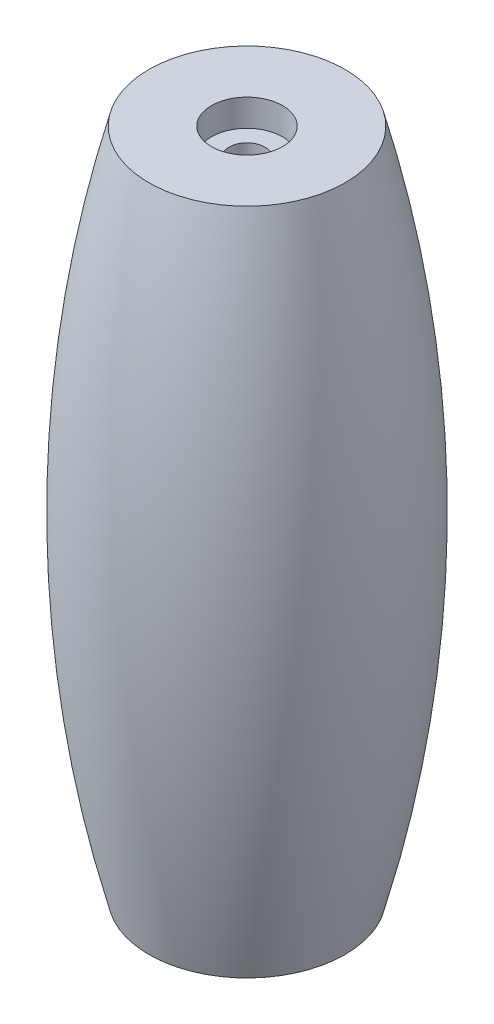
ISO-10303-21;
HEADER;
FILE_DESCRIPTION(('STEP AP214'),'2;1');
FILE_NAME('part.step','',(''),(''),'','','');
FILE_SCHEMA(('AUTOMOTIVE_DESIGN { 1 0 10303 214 1 1 1 1 }'));
ENDSEC;
DATA;
#1=APPLICATION_CONTEXT('core data for automotive mechanical design processes');
#2=APPLICATION_PROTOCOL_DEFINITION('international standard','automotive_design',2000,#1);
#3=PRODUCT_CONTEXT('',#1,'mechanical');
#4=PRODUCT('Part','Part','',(#3));
#5=PRODUCT_RELATED_PRODUCT_CATEGORY('part','',(#4));
#6=PRODUCT_DEFINITION_FORMATION('','',#4);
#7=PRODUCT_DEFINITION_CONTEXT('part definition',#1,'design');
#8=PRODUCT_DEFINITION('design','',#6,#7);
#9=PRODUCT_DEFINITION_SHAPE('','',#8);
#10=(LENGTH_UNIT() NAMED_UNIT(*) SI_UNIT(.MILLI.,.METRE.));
#11=(NAMED_UNIT(*) PLANE_ANGLE_UNIT() SI_UNIT($,.RADIAN.));
#12=(NAMED_UNIT(*) SI_UNIT($,.STERADIAN.) SOLID_ANGLE_UNIT());
#13=UNCERTAINTY_MEASURE_WITH_UNIT(LENGTH_MEASURE(1.E-05),#10,'distance_accuracy_value','');
#14=(GEOMETRIC_REPRESENTATION_CONTEXT(3) GLOBAL_UNCERTAINTY_ASSIGNED_CONTEXT((#13)) GLOBAL_UNIT_ASSIGNED_CONTEXT((#10,
#11,#12)) REPRESENTATION_CONTEXT('',''));
#15=CARTESIAN_POINT('',(0.,0.,0.));
#16=DIRECTION('',(0.,0.,1.));
#17=DIRECTION('',(1.,0.,0.));
#18=AXIS2_PLACEMENT_3D('',#15,#16,#17);
#19=CARTESIAN_POINT('',(-19.0896786785979,-31.5091057655142,0.));
#20=DIRECTION('',(0.,1.,0.));
#21=DIRECTION('',(-1.,0.,0.));
#22=AXIS2_PLACEMENT_3D('',#19,#20,#21);
#23=CYLINDRICAL_SURFACE('',#22,1.175);
#24=CARTESIAN_POINT('',(-19.0896786785979,-29.7231057655142,0.));
#25=DIRECTION('',(0.,-1.,0.));
#26=DIRECTION('',(1.,0.,0.));
#27=AXIS2_PLACEMENT_3D('',#24,#25,#26);
#28=CIRCLE('',#27,1.175);
#29=CARTESIAN_POINT('',(-17.9146786785979,-29.7231057655142,0.));
#30=VERTEX_POINT('',#29);
#31=EDGE_CURVE('E49',#30,#30,#28,.F.);
#32=ORIENTED_EDGE('',*,*,#31,.F.);
#33=EDGE_LOOP('',(#32));
#34=FACE_BOUND('',#33,.T.);
#35=CARTESIAN_POINT('',(-19.0896786785979,10.8848942344858,0.));
#36=DIRECTION('',(0.,1.,0.));
#37=DIRECTION('',(-1.,0.,0.));
#38=AXIS2_PLACEMENT_3D('',#35,#36,#37);
#39=CIRCLE('',#38,1.175);
#40=CARTESIAN_POINT('',(-20.2646786785979,10.8848942344858,0.));
#41=VERTEX_POINT('',#40);
#42=EDGE_CURVE('E40',#41,#41,#39,.F.);
#43=ORIENTED_EDGE('',*,*,#42,.F.);
#44=EDGE_LOOP('',(#43));
#45=FACE_BOUND('',#44,.T.);
#46=ADVANCED_FACE('F36',(#34,#45),#23,.F.);
#47=CARTESIAN_POINT('',(-19.089678678598,-9.41910576551423,0.));
#48=DIRECTION('',(0.,1.,0.));
#49=DIRECTION('',(-1.,0.,0.));
#50=AXIS2_PLACEMENT_3D('',#47,#48,#49);
#51=DEGENERATE_TOROIDAL_SURFACE('',#50,76.9844863119006,86.3454912187109,.F.);
#52=CARTESIAN_POINT('',(-19.0896786785979,-31.5091057655142,0.));
#53=DIRECTION('',(0.,1.,0.));
#54=DIRECTION('',(-1.,0.,0.));
#55=AXIS2_PLACEMENT_3D('',#52,#53,#54);
#56=CIRCLE('',#55,6.48751949723563);
#57=CARTESIAN_POINT('',(-25.5771981758336,-31.5091057655142,0.));
#58=VERTEX_POINT('',#57);
#59=EDGE_CURVE('E44',#58,#58,#56,.T.);
#60=ORIENTED_EDGE('',*,*,#59,.T.);
#61=EDGE_LOOP('',(#60));
#62=FACE_BOUND('',#61,.T.);
#63=CARTESIAN_POINT('',(-19.0896786785979,12.6708942344858,0.));
#64=DIRECTION('',(0.,1.,0.));
#65=DIRECTION('',(-1.,0.,0.));
#66=AXIS2_PLACEMENT_3D('',#63,#64,#65);
#67=CIRCLE('',#66,6.48751949723563);
#68=CARTESIAN_POINT('',(-25.5771981758336,12.6708942344858,0.));
#69=VERTEX_POINT('',#68);
#70=EDGE_CURVE('E10',#69,#69,#67,.T.);
#71=ORIENTED_EDGE('',*,*,#70,.F.);
#72=EDGE_LOOP('',(#71));
#73=FACE_BOUND('',#72,.T.);
#74=ADVANCED_FACE('F38',(#62,#73),#51,.F.);
#75=CARTESIAN_POINT('',(-1.14538072071588,12.6708942344858,0.));
#76=DIRECTION('',(0.,1.,0.));
#77=DIRECTION('',(-1.,0.,0.));
#78=AXIS2_PLACEMENT_3D('',#75,#76,#77);
#79=PLANE('',#78);
#80=CARTESIAN_POINT('',(-19.0896786785979,12.6708942344858,0.));
#81=DIRECTION('',(0.,1.,0.));
#82=DIRECTION('',(-1.,0.,0.));
#83=AXIS2_PLACEMENT_3D('',#80,#81,#82);
#84=CIRCLE('',#83,2.35);
#85=CARTESIAN_POINT('',(-21.4396786785979,12.6708942344858,0.));
#86=VERTEX_POINT('',#85);
#87=EDGE_CURVE('E63',#86,#86,#84,.T.);
#88=ORIENTED_EDGE('',*,*,#87,.F.);
#89=EDGE_LOOP('',(#88));
#90=FACE_BOUND('',#89,.T.);
#91=ORIENTED_EDGE('',*,*,#70,.T.);
#92=EDGE_LOOP('',(#91));
#93=FACE_BOUND('',#92,.T.);
#94=ADVANCED_FACE('F81',(#90,#93),#79,.T.);
#95=CARTESIAN_POINT('',(-1.14538072071587,-31.5091057655142,0.));
#96=DIRECTION('',(0.,1.,0.));
#97=DIRECTION('',(-1.,0.,0.));
#98=AXIS2_PLACEMENT_3D('',#95,#96,#97);
#99=PLANE('',#98);
#100=CARTESIAN_POINT('',(-19.0896786785979,-31.5091057655142,0.));
#101=DIRECTION('',(0.,-1.,0.));
#102=DIRECTION('',(1.,0.,0.));
#103=AXIS2_PLACEMENT_3D('',#100,#101,#102);
#104=CIRCLE('',#103,2.35);
#105=CARTESIAN_POINT('',(-16.7396786785979,-31.5091057655142,0.));
#106=VERTEX_POINT('',#105);
#107=EDGE_CURVE('E57',#106,#106,#104,.T.);
#108=ORIENTED_EDGE('',*,*,#107,.F.);
#109=EDGE_LOOP('',(#108));
#110=FACE_BOUND('',#109,.T.);
#111=ORIENTED_EDGE('',*,*,#59,.F.);
#112=EDGE_LOOP('',(#111));
#113=FACE_BOUND('',#112,.T.);
#114=ADVANCED_FACE('F87',(#110,#113),#99,.F.);
#115=CARTESIAN_POINT('',(-19.0896786785979,-29.7231057655142,0.));
#116=DIRECTION('',(0.,-1.,0.));
#117=DIRECTION('',(1.,0.,0.));
#118=AXIS2_PLACEMENT_3D('',#115,#116,#117);
#119=PLANE('',#118);
#120=CARTESIAN_POINT('',(-19.0896786785979,-29.7231057655142,0.));
#121=DIRECTION('',(0.,-1.,0.));
#122=DIRECTION('',(1.,0.,0.));
#123=AXIS2_PLACEMENT_3D('',#120,#121,#122);
#124=CIRCLE('',#123,2.35);
#125=CARTESIAN_POINT('',(-16.7396786785979,-29.7231057655142,0.));
#126=VERTEX_POINT('',#125);
#127=EDGE_CURVE('E53',#126,#126,#124,.T.);
#128=ORIENTED_EDGE('',*,*,#127,.T.);
#129=EDGE_LOOP('',(#128));
#130=FACE_BOUND('',#129,.T.);
#131=ORIENTED_EDGE('',*,*,#31,.T.);
#132=EDGE_LOOP('',(#131));
#133=FACE_BOUND('',#132,.T.);
#134=ADVANCED_FACE('F89',(#130,#133),#119,.T.);
#135=CARTESIAN_POINT('',(-19.0896786785979,-29.7231057655142,0.));
#136=DIRECTION('',(0.,-1.,0.));
#137=DIRECTION('',(1.,0.,0.));
#138=AXIS2_PLACEMENT_3D('',#135,#136,#137);
#139=CYLINDRICAL_SURFACE('',#138,2.35);
#140=CARTESIAN_POINT('',(-16.7396786785979,-29.7231057655142,0.));
#141=CARTESIAN_POINT('',(-16.7396786785979,-29.7417099321809,0.));
#142=CARTESIAN_POINT('',(-16.7396786785979,-29.7603140988476,0.));
#143=CARTESIAN_POINT('',(-16.7396786785979,-29.7975224321809,0.));
#144=CARTESIAN_POINT('',(-16.7396786785979,-29.8161265988476,0.));
#145=CARTESIAN_POINT('',(-16.7396786785979,-29.8533349321809,0.));
#146=CARTESIAN_POINT('',(-16.7396786785979,-29.8719390988476,0.));
#147=CARTESIAN_POINT('',(-16.7396786785979,-29.9091474321809,0.));
#148=CARTESIAN_POINT('',(-16.7396786785979,-29.9277515988476,0.));
#149=CARTESIAN_POINT('',(-16.7396786785979,-29.9649599321809,0.));
#150=CARTESIAN_POINT('',(-16.7396786785979,-29.9835640988476,0.));
#151=CARTESIAN_POINT('',(-16.7396786785979,-30.0207724321809,0.));
#152=CARTESIAN_POINT('',(-16.7396786785979,-30.0393765988476,0.));
#153=CARTESIAN_POINT('',(-16.7396786785979,-30.0765849321809,0.));
#154=CARTESIAN_POINT('',(-16.7396786785979,-30.0951890988476,0.));
#155=CARTESIAN_POINT('',(-16.7396786785979,-30.1323974321809,0.));
#156=CARTESIAN_POINT('',(-16.7396786785979,-30.1510015988476,0.));
#157=CARTESIAN_POINT('',(-16.7396786785979,-30.1882099321809,0.));
#158=CARTESIAN_POINT('',(-16.7396786785979,-30.2068140988476,0.));
#159=CARTESIAN_POINT('',(-16.7396786785979,-30.2440224321809,0.));
#160=CARTESIAN_POINT('',(-16.7396786785979,-30.2626265988476,0.));
#161=CARTESIAN_POINT('',(-16.7396786785979,-30.2998349321809,0.));
#162=CARTESIAN_POINT('',(-16.7396786785979,-30.3184390988476,0.));
#163=CARTESIAN_POINT('',(-16.7396786785979,-30.3556474321809,0.));
#164=CARTESIAN_POINT('',(-16.7396786785979,-30.3742515988476,0.));
#165=CARTESIAN_POINT('',(-16.7396786785979,-30.4114599321809,0.));
#166=CARTESIAN_POINT('',(-16.7396786785979,-30.4300640988476,0.));
#167=CARTESIAN_POINT('',(-16.7396786785979,-30.4672724321809,0.));
#168=CARTESIAN_POINT('',(-16.7396786785979,-30.4858765988476,0.));
#169=CARTESIAN_POINT('',(-16.7396786785979,-30.5230849321809,0.));
#170=CARTESIAN_POINT('',(-16.7396786785979,-30.5416890988476,0.));
#171=CARTESIAN_POINT('',(-16.7396786785979,-30.5788974321809,0.));
#172=CARTESIAN_POINT('',(-16.7396786785979,-30.5975015988476,0.));
#173=CARTESIAN_POINT('',(-16.7396786785979,-30.6347099321809,0.));
#174=CARTESIAN_POINT('',(-16.7396786785979,-30.6533140988476,0.));
#175=CARTESIAN_POINT('',(-16.7396786785979,-30.6905224321809,0.));
#176=CARTESIAN_POINT('',(-16.7396786785979,-30.7091265988476,0.));
#177=CARTESIAN_POINT('',(-16.7396786785979,-30.7463349321809,0.));
#178=CARTESIAN_POINT('',(-16.7396786785979,-30.7649390988476,0.));
#179=CARTESIAN_POINT('',(-16.7396786785979,-30.8021474321809,0.));
#180=CARTESIAN_POINT('',(-16.7396786785979,-30.8207515988476,0.));
#181=CARTESIAN_POINT('',(-16.7396786785979,-30.8579599321809,0.));
#182=CARTESIAN_POINT('',(-16.7396786785979,-30.8765640988476,0.));
#183=CARTESIAN_POINT('',(-16.7396786785979,-30.9137724321809,0.));
#184=CARTESIAN_POINT('',(-16.7396786785979,-30.9323765988476,0.));
#185=CARTESIAN_POINT('',(-16.7396786785979,-30.9695849321809,0.));
#186=CARTESIAN_POINT('',(-16.7396786785979,-30.9881890988476,0.));
#187=CARTESIAN_POINT('',(-16.7396786785979,-31.0253974321809,0.));
#188=CARTESIAN_POINT('',(-16.7396786785979,-31.0440015988476,0.));
#189=CARTESIAN_POINT('',(-16.7396786785979,-31.0812099321809,0.));
#190=CARTESIAN_POINT('',(-16.7396786785979,-31.0998140988476,0.));
#191=CARTESIAN_POINT('',(-16.7396786785979,-31.1370224321809,0.));
#192=CARTESIAN_POINT('',(-16.7396786785979,-31.1556265988476,0.));
#193=CARTESIAN_POINT('',(-16.7396786785979,-31.1928349321809,0.));
#194=CARTESIAN_POINT('',(-16.7396786785979,-31.2114390988476,0.));
#195=CARTESIAN_POINT('',(-16.7396786785979,-31.2486474321809,0.));
#196=CARTESIAN_POINT('',(-16.7396786785979,-31.2672515988476,0.));
#197=CARTESIAN_POINT('',(-16.7396786785979,-31.3044599321809,0.));
#198=CARTESIAN_POINT('',(-16.7396786785979,-31.3230640988476,0.));
#199=CARTESIAN_POINT('',(-16.7396786785979,-31.3602724321809,0.));
#200=CARTESIAN_POINT('',(-16.7396786785979,-31.3788765988476,0.));
#201=CARTESIAN_POINT('',(-16.7396786785979,-31.4160849321809,0.));
#202=CARTESIAN_POINT('',(-16.7396786785979,-31.4346890988476,0.));
#203=CARTESIAN_POINT('',(-16.7396786785979,-31.4718974321809,0.));
#204=CARTESIAN_POINT('',(-16.7396786785979,-31.4905015988476,0.));
#205=CARTESIAN_POINT('',(-16.7396786785979,-31.5091057655142,0.));
#206=B_SPLINE_CURVE_WITH_KNOTS('',3,(#140,#141,#142,#143,#144,#145,#146,#147,#148,#149,#150,
#151,#152,#153,#154,#155,#156,#157,#158,#159,#160,#161,#162,#163,#164,#165,#166,#167,#168,#169,
#170,#171,#172,#173,#174,#175,#176,#177,#178,#179,#180,#181,#182,#183,#184,#185,#186,#187,#188,
#189,#190,#191,#192,#193,#194,#195,#196,#197,#198,#199,#200,#201,#202,#203,#204,#205),
.UNSPECIFIED.,.F.,.F.,(4,2,2,2,2,2,2,2,2,2,2,2,2,2,2,2,2,2,2,2,2,2,2,2,2,2,2,2,2,2,2,2,4),(0.,
0.0558124999999986,0.111624999999997,0.167437499999996,0.223249999999998,0.279062499999996,
0.334874999999995,0.390687499999997,0.446499999999996,0.502312499999994,0.558124999999996,
0.613937499999995,0.669749999999993,0.725562499999995,0.781374999999994,0.837187499999992,
0.892999999999994,0.948812499999993,1.00462499999999,1.06043749999999,1.11624999999999,
1.17206249999999,1.22787499999999,1.28368749999999,1.33949999999999,1.39531249999999,
1.45112499999999,1.50693749999999,1.56274999999999,1.61856249999999,1.67437499999999,
1.73018749999999,1.78599999999999),.UNSPECIFIED.);
#207=EDGE_CURVE('BSEAM85',#126,#106,#206,.T.);
#208=ORIENTED_EDGE('',*,*,#127,.F.);
#209=ORIENTED_EDGE('',*,*,#107,.T.);
#210=ORIENTED_EDGE('',*,*,#207,.T.);
#211=ORIENTED_EDGE('',*,*,#207,.F.);
#212=EDGE_LOOP('',(#208,#210,#209,#211));
#213=FACE_BOUND('',#212,.T.);
#214=ADVANCED_FACE('F85',(#213),#139,.F.);
#215=CARTESIAN_POINT('',(-19.0896786785979,10.8848942344858,0.));
#216=DIRECTION('',(0.,1.,0.));
#217=DIRECTION('',(-1.,0.,0.));
#218=AXIS2_PLACEMENT_3D('',#215,#216,#217);
#219=PLANE('',#218);
#220=CARTESIAN_POINT('',(-19.0896786785979,10.8848942344858,0.));
#221=DIRECTION('',(0.,1.,0.));
#222=DIRECTION('',(-1.,0.,0.));
#223=AXIS2_PLACEMENT_3D('',#220,#221,#222);
#224=CIRCLE('',#223,2.35);
#225=CARTESIAN_POINT('',(-21.4396786785979,10.8848942344858,0.));
#226=VERTEX_POINT('',#225);
#227=EDGE_CURVE('E66',#226,#226,#224,.T.);
#228=ORIENTED_EDGE('',*,*,#227,.T.);
#229=EDGE_LOOP('',(#228));
#230=FACE_BOUND('',#229,.T.);
#231=ORIENTED_EDGE('',*,*,#42,.T.);
#232=EDGE_LOOP('',(#231));
#233=FACE_BOUND('',#232,.T.);
#234=ADVANCED_FACE('F73',(#230,#233),#219,.T.);
#235=CARTESIAN_POINT('',(-19.0896786785979,10.8848942344858,0.));
#236=DIRECTION('',(0.,1.,0.));
#237=DIRECTION('',(-1.,0.,0.));
#238=AXIS2_PLACEMENT_3D('',#235,#236,#237);
#239=CYLINDRICAL_SURFACE('',#238,2.35);
#240=CARTESIAN_POINT('',(-21.4396786785979,10.8848942344858,0.));
#241=CARTESIAN_POINT('',(-21.4396786785979,10.9034984011525,0.));
#242=CARTESIAN_POINT('',(-21.4396786785979,10.9221025678191,0.));
#243=CARTESIAN_POINT('',(-21.4396786785979,10.9593109011525,0.));
#244=CARTESIAN_POINT('',(-21.4396786785979,10.9779150678191,0.));
#245=CARTESIAN_POINT('',(-21.4396786785979,11.0151234011525,0.));
#246=CARTESIAN_POINT('',(-21.4396786785979,11.0337275678191,0.));
#247=CARTESIAN_POINT('',(-21.4396786785979,11.0709359011525,0.));
#248=CARTESIAN_POINT('',(-21.4396786785979,11.0895400678191,0.));
#249=CARTESIAN_POINT('',(-21.4396786785979,11.1267484011525,0.));
#250=CARTESIAN_POINT('',(-21.4396786785979,11.1453525678191,0.));
#251=CARTESIAN_POINT('',(-21.4396786785979,11.1825609011525,0.));
#252=CARTESIAN_POINT('',(-21.4396786785979,11.2011650678191,0.));
#253=CARTESIAN_POINT('',(-21.4396786785979,11.2383734011525,0.));
#254=CARTESIAN_POINT('',(-21.4396786785979,11.2569775678191,0.));
#255=CARTESIAN_POINT('',(-21.4396786785979,11.2941859011525,0.));
#256=CARTESIAN_POINT('',(-21.4396786785979,11.3127900678191,0.));
#257=CARTESIAN_POINT('',(-21.4396786785979,11.3499984011525,0.));
#258=CARTESIAN_POINT('',(-21.4396786785979,11.3686025678191,0.));
#259=CARTESIAN_POINT('',(-21.4396786785979,11.4058109011525,0.));
#260=CARTESIAN_POINT('',(-21.4396786785979,11.4244150678191,0.));
#261=CARTESIAN_POINT('',(-21.4396786785979,11.4616234011525,0.));
#262=CARTESIAN_POINT('',(-21.4396786785979,11.4802275678191,0.));
#263=CARTESIAN_POINT('',(-21.4396786785979,11.5174359011525,0.));
#264=CARTESIAN_POINT('',(-21.4396786785979,11.5360400678191,0.));
#265=CARTESIAN_POINT('',(-21.4396786785979,11.5732484011525,0.));
#266=CARTESIAN_POINT('',(-21.4396786785979,11.5918525678191,0.));
#267=CARTESIAN_POINT('',(-21.4396786785979,11.6290609011525,0.));
#268=CARTESIAN_POINT('',(-21.4396786785979,11.6476650678191,0.));
#269=CARTESIAN_POINT('',(-21.4396786785979,11.6848734011525,0.));
#270=CARTESIAN_POINT('',(-21.4396786785979,11.7034775678191,0.));
#271=CARTESIAN_POINT('',(-21.4396786785979,11.7406859011525,0.));
#272=CARTESIAN_POINT('',(-21.4396786785979,11.7592900678191,0.));
#273=CARTESIAN_POINT('',(-21.4396786785979,11.7964984011525,0.));
#274=CARTESIAN_POINT('',(-21.4396786785979,11.8151025678191,0.));
#275=CARTESIAN_POINT('',(-21.4396786785979,11.8523109011525,0.));
#276=CARTESIAN_POINT('',(-21.4396786785979,11.8709150678191,0.));
#277=CARTESIAN_POINT('',(-21.4396786785979,11.9081234011525,0.));
#278=CARTESIAN_POINT('',(-21.4396786785979,11.9267275678191,0.));
#279=CARTESIAN_POINT('',(-21.4396786785979,11.9639359011525,0.));
#280=CARTESIAN_POINT('',(-21.4396786785979,11.9825400678191,0.));
#281=CARTESIAN_POINT('',(-21.4396786785979,12.0197484011525,0.));
#282=CARTESIAN_POINT('',(-21.4396786785979,12.0383525678191,0.));
#283=CARTESIAN_POINT('',(-21.4396786785979,12.0755609011525,0.));
#284=CARTESIAN_POINT('',(-21.4396786785979,12.0941650678191,0.));
#285=CARTESIAN_POINT('',(-21.4396786785979,12.1313734011524,0.));
#286=CARTESIAN_POINT('',(-21.4396786785979,12.1499775678191,0.));
#287=CARTESIAN_POINT('',(-21.4396786785979,12.1871859011525,0.));
#288=CARTESIAN_POINT('',(-21.4396786785979,12.2057900678191,0.));
#289=CARTESIAN_POINT('',(-21.4396786785979,12.2429984011525,0.));
#290=CARTESIAN_POINT('',(-21.4396786785979,12.2616025678191,0.));
#291=CARTESIAN_POINT('',(-21.4396786785979,12.2988109011525,0.));
#292=CARTESIAN_POINT('',(-21.4396786785979,12.3174150678191,0.));
#293=CARTESIAN_POINT('',(-21.4396786785979,12.3546234011525,0.));
#294=CARTESIAN_POINT('',(-21.4396786785979,12.3732275678191,0.));
#295=CARTESIAN_POINT('',(-21.4396786785979,12.4104359011525,0.));
#296=CARTESIAN_POINT('',(-21.4396786785979,12.4290400678191,0.));
#297=CARTESIAN_POINT('',(-21.4396786785979,12.4662484011525,0.));
#298=CARTESIAN_POINT('',(-21.4396786785979,12.4848525678191,0.));
#299=CARTESIAN_POINT('',(-21.4396786785979,12.5220609011525,0.));
#300=CARTESIAN_POINT('',(-21.4396786785979,12.5406650678191,0.));
#301=CARTESIAN_POINT('',(-21.4396786785979,12.5778734011525,0.));
#302=CARTESIAN_POINT('',(-21.4396786785979,12.5964775678191,0.));
#303=CARTESIAN_POINT('',(-21.4396786785979,12.6336859011525,0.));
#304=CARTESIAN_POINT('',(-21.4396786785979,12.6522900678191,0.));
#305=CARTESIAN_POINT('',(-21.4396786785979,12.6708942344858,0.));
#306=B_SPLINE_CURVE_WITH_KNOTS('',3,(#240,#241,#242,#243,#244,#245,#246,#247,#248,#249,#250,
#251,#252,#253,#254,#255,#256,#257,#258,#259,#260,#261,#262,#263,#264,#265,#266,#267,#268,#269,
#270,#271,#272,#273,#274,#275,#276,#277,#278,#279,#280,#281,#282,#283,#284,#285,#286,#287,#288,
#289,#290,#291,#292,#293,#294,#295,#296,#297,#298,#299,#300,#301,#302,#303,#304,#305),
.UNSPECIFIED.,.F.,.F.,(4,2,2,2,2,2,2,2,2,2,2,2,2,2,2,2,2,2,2,2,2,2,2,2,2,2,2,2,2,2,2,2,4),(0.,
0.0558124999999986,0.111624999999999,0.167437499999999,0.22325,0.2790625,0.334874999999998,
0.390687499999999,0.446499999999999,0.502312499999999,0.558125,0.613937499999998,
0.669749999999999,0.725562499999999,0.781374999999999,0.837187499999999,0.893,0.948812499999998,
1.004625,1.0604375,1.11625,1.1720625,1.227875,1.2836875,1.3395,1.3953125,1.451125,1.5069375,
1.56275,1.6185625,1.674375,1.7301875,1.786),.UNSPECIFIED.);
#307=EDGE_CURVE('BSEAM97',#226,#86,#306,.T.);
#308=ORIENTED_EDGE('',*,*,#227,.F.);
#309=ORIENTED_EDGE('',*,*,#87,.T.);
#310=ORIENTED_EDGE('',*,*,#307,.T.);
#311=ORIENTED_EDGE('',*,*,#307,.F.);
#312=EDGE_LOOP('',(#308,#310,#309,#311));
#313=FACE_BOUND('',#312,.T.);
#314=ADVANCED_FACE('F97',(#313),#239,.F.);
#315=CLOSED_SHELL('',(#46,#74,#94,#114,#134,#214,#234,#314));
#316=MANIFOLD_SOLID_BREP('B2',#315);
#317=ADVANCED_BREP_SHAPE_REPRESENTATION('',(#18,#316),#14);
#318=SHAPE_DEFINITION_REPRESENTATION(#9,#317);
ENDSEC;
END-ISO-10303-21;
